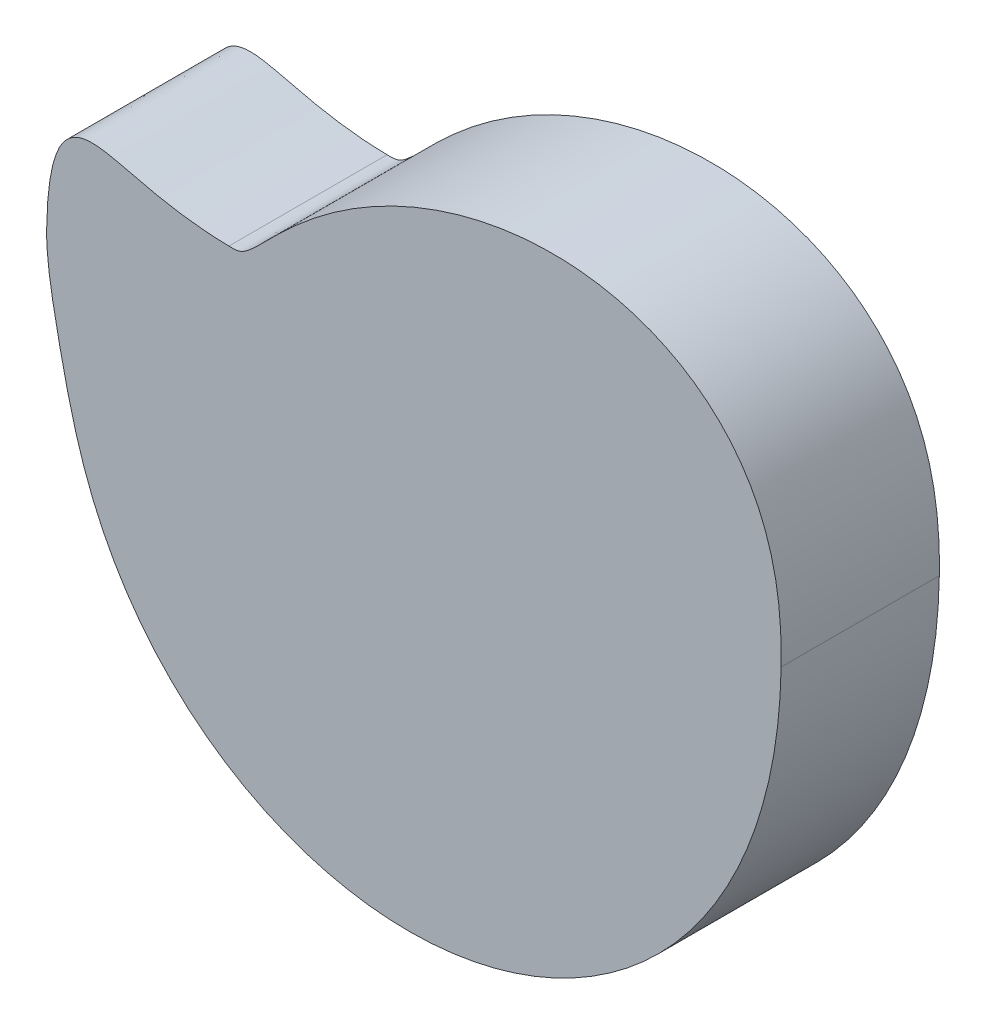
ISO-10303-21;
HEADER;
FILE_DESCRIPTION(('STEP AP214'),'2;1');
FILE_NAME('part.step','',(''),(''),'','','');
FILE_SCHEMA(('AUTOMOTIVE_DESIGN { 1 0 10303 214 1 1 1 1 }'));
ENDSEC;
DATA;
#1=APPLICATION_CONTEXT('core data for automotive mechanical design processes');
#2=APPLICATION_PROTOCOL_DEFINITION('international standard','automotive_design',2000,#1);
#3=PRODUCT_CONTEXT('',#1,'mechanical');
#4=PRODUCT('Part','Part','',(#3));
#5=PRODUCT_RELATED_PRODUCT_CATEGORY('part','',(#4));
#6=PRODUCT_DEFINITION_FORMATION('','',#4);
#7=PRODUCT_DEFINITION_CONTEXT('part definition',#1,'design');
#8=PRODUCT_DEFINITION('design','',#6,#7);
#9=PRODUCT_DEFINITION_SHAPE('','',#8);
#10=(LENGTH_UNIT() NAMED_UNIT(*) SI_UNIT(.MILLI.,.METRE.));
#11=(NAMED_UNIT(*) PLANE_ANGLE_UNIT() SI_UNIT($,.RADIAN.));
#12=(NAMED_UNIT(*) SI_UNIT($,.STERADIAN.) SOLID_ANGLE_UNIT());
#13=UNCERTAINTY_MEASURE_WITH_UNIT(LENGTH_MEASURE(1.E-05),#10,'distance_accuracy_value','');
#14=(GEOMETRIC_REPRESENTATION_CONTEXT(3) GLOBAL_UNCERTAINTY_ASSIGNED_CONTEXT((#13)) GLOBAL_UNIT_ASSIGNED_CONTEXT((#10,
#11,#12)) REPRESENTATION_CONTEXT('',''));
#15=CARTESIAN_POINT('',(0.,0.,0.));
#16=DIRECTION('',(0.,0.,1.));
#17=DIRECTION('',(1.,0.,0.));
#18=AXIS2_PLACEMENT_3D('',#15,#16,#17);
#19=CARTESIAN_POINT('',(69.998811140177,-0.653452584900594,20.));
#20=CARTESIAN_POINT('',(69.9962802606768,-0.80282905193423,20.));
#21=CARTESIAN_POINT('',(69.9902208525941,-1.09458744396149,20.));
#22=CARTESIAN_POINT('',(69.9742626990175,-1.73918612678377,20.));
#23=CARTESIAN_POINT('',(69.9506146409642,-2.33836731690116,20.));
#24=CARTESIAN_POINT('',(69.9100236263824,-3.23412195359361,20.));
#25=CARTESIAN_POINT('',(69.8487920108159,-4.23488834275558,20.));
#26=CARTESIAN_POINT('',(69.7563123500048,-5.44472611450939,20.));
#27=CARTESIAN_POINT('',(69.6228227592227,-6.79851808741762,20.));
#28=CARTESIAN_POINT('',(69.460461293575,-8.16341536992499,20.));
#29=CARTESIAN_POINT('',(69.2692414784587,-9.51627246653767,20.));
#30=CARTESIAN_POINT('',(69.0485912669528,-10.8696133684943,20.));
#31=CARTESIAN_POINT('',(68.7983176336395,-12.2147919486517,20.));
#32=CARTESIAN_POINT('',(68.5180342400937,-13.5558622770326,20.));
#33=CARTESIAN_POINT('',(68.2075090357461,-14.8891538431174,20.));
#34=CARTESIAN_POINT('',(67.8664562446968,-16.2156383350755,20.));
#35=CARTESIAN_POINT('',(67.4946648660791,-17.5334347919806,20.));
#36=CARTESIAN_POINT('',(67.0919231330588,-18.8423533381347,20.));
#37=CARTESIAN_POINT('',(66.6580666630912,-20.1411460305897,20.));
#38=CARTESIAN_POINT('',(66.1929516424067,-21.4291661207347,20.));
#39=CARTESIAN_POINT('',(65.6964732415011,-22.705379393146,20.));
#40=CARTESIAN_POINT('',(65.0365777264447,-24.2848303096609,20.));
#41=CARTESIAN_POINT('',(63.8968110510776,-26.7756310232163,20.));
#42=CARTESIAN_POINT('',(62.4493173352622,-29.4988355269483,20.));
#43=CARTESIAN_POINT('',(60.6326292546219,-32.4046935244352,20.));
#44=CARTESIAN_POINT('',(58.6123986494386,-35.1702513591954,20.));
#45=CARTESIAN_POINT('',(56.8767312626089,-37.2903230800499,20.));
#46=CARTESIAN_POINT('',(54.5543679776766,-39.8230325056132,20.));
#47=CARTESIAN_POINT('',(51.543500376313,-42.6417850527887,20.));
#48=CARTESIAN_POINT('',(47.7251273785978,-45.5750406943762,20.));
#49=CARTESIAN_POINT('',(42.9929093963224,-48.3812562872062,20.));
#50=CARTESIAN_POINT('',(37.937318134281,-50.5982700302847,20.));
#51=CARTESIAN_POINT('',(32.615906499919,-52.1765019156233,20.));
#52=CARTESIAN_POINT('',(27.1072465104206,-53.0699063488008,20.));
#53=CARTESIAN_POINT('',(21.4996033747864,-53.2441713372864,20.));
#54=CARTESIAN_POINT('',(15.9168519238734,-52.6866292315394,20.));
#55=CARTESIAN_POINT('',(10.4548694753436,-51.4037476301565,20.));
#56=CARTESIAN_POINT('',(5.20805320446119,-49.4161935320205,20.));
#57=CARTESIAN_POINT('',(0.266965943790503,-46.7582449027088,20.));
#58=CARTESIAN_POINT('',(-3.71513452247623,-43.8871457040942,20.));
#59=CARTESIAN_POINT('',(-6.83716953013065,-41.0735627475727,20.));
#60=CARTESIAN_POINT('',(-9.22480258633339,-38.5157964640865,20.));
#61=CARTESIAN_POINT('',(-10.9995459376571,-36.3511591971393,20.));
#62=CARTESIAN_POINT('',(-12.7304398274647,-33.9428488013515,20.));
#63=CARTESIAN_POINT('',(-14.3830656463562,-31.2812613343131,20.));
#64=CARTESIAN_POINT('',(-15.8439342578662,-28.5094094561044,20.));
#65=CARTESIAN_POINT('',(-17.1146877178155,-25.646281173357,20.));
#66=CARTESIAN_POINT('',(-18.1575396153297,-22.87057462196,20.));
#67=CARTESIAN_POINT('',(-19.0126919495131,-20.2062308040494,20.));
#68=CARTESIAN_POINT('',(-19.7563721502024,-17.5089920909637,20.));
#69=CARTESIAN_POINT('',(-20.4133755837632,-14.789664210606,20.));
#70=CARTESIAN_POINT('',(-20.9382239554045,-12.3989249728729,20.));
#71=CARTESIAN_POINT('',(-21.3676480801718,-10.3453792909695,20.));
#72=CARTESIAN_POINT('',(-21.7119482565548,-8.63134202986937,20.));
#73=CARTESIAN_POINT('',(-21.9765681282614,-7.2579296072446,20.));
#74=CARTESIAN_POINT('',(-22.1971401447687,-6.03681456631008,20.));
#75=CARTESIAN_POINT('',(-22.3738294613666,-4.96800318238054,20.));
#76=CARTESIAN_POINT('',(-22.5099938730841,-4.05276590917512,20.));
#77=CARTESIAN_POINT('',(-22.6114252988122,-3.29147361353848,20.));
#78=CARTESIAN_POINT('',(-22.6993518269821,-2.5292366804464,20.));
#79=CARTESIAN_POINT('',(-22.7716148327162,-1.76399762504704,20.));
#80=CARTESIAN_POINT('',(-22.819281051065,-1.09548816367898,20.));
#81=CARTESIAN_POINT('',(-22.8451580083226,-0.565511188836867,20.));
#82=CARTESIAN_POINT('',(-22.8577147257473,-0.185256378547976,20.));
#83=CARTESIAN_POINT('',(-22.8631929144728,0.0531263644279066,20.));
#84=CARTESIAN_POINT('',(-22.8660512076708,0.248202442117592,20.));
#85=CARTESIAN_POINT('',(-22.8673031315266,0.450386942015034,20.));
#86=CARTESIAN_POINT('',(-22.8670073548948,0.654111362240895,20.));
#87=CARTESIAN_POINT('',(-22.8658320009819,0.794250234163967,20.));
#88=CARTESIAN_POINT('',(-22.8646807412842,0.878041737602729,20.));
#89=CARTESIAN_POINT('',(-22.8639712364946,0.919917819969421,20.));
#90=B_SPLINE_CURVE_WITH_KNOTS('',4,(#19,#20,#21,#22,#23,#24,#25,#26,#27,#28,#29,#30,#31,#32,#33,
#34,#35,#36,#37,#38,#39,#40,#41,#42,#43,#44,#45,#46,#47,#48,#49,#50,#51,#52,#53,#54,#55,#56,#57,
#58,#59,#60,#61,#62,#63,#64,#65,#66,#67,#68,#69,#70,#71,#72,#73,#74,#75,#76,#77,#78,#79,#80,#81,
#82,#83,#84,#85,#86,#87,#88,#89),.UNSPECIFIED.,.F.,.F.,(5,1,1,1,1,1,1,1,1,1,1,1,1,1,1,1,1,1,1,1,
1,1,1,1,1,1,1,1,1,1,1,1,1,1,1,1,1,1,1,1,1,1,1,1,1,1,1,1,1,1,1,1,1,1,1,1,1,1,1,1,1,1,1,1,1,1,1,
5),(0.0872867349555559,0.0910891372792561,0.0948915396029563,0.0986939419266564,
0.102496344250357,0.110101148897757,0.117705953545157,0.125310758192558,0.132915562839958,
0.140520367487358,0.148125172134759,0.155729978217746,0.163334784300732,0.170939590383719,
0.178544396466706,0.186149202549693,0.19375400863268,0.201358814715667,0.208963620798653,
0.216568425977464,0.224173231156274,0.239382841513894,0.269802062229134,0.285011675955639,
0.300221289682145,0.31543090340865,0.330640517135155,0.361310619663562,0.391729917099579,
0.422149113967499,0.452568309378908,0.483639973393714,0.514711605323261,0.545783189159578,
0.576854883051291,0.607926524798288,0.638998111590847,0.670069826266896,0.701141369164623,
0.716677270094364,0.732213171024105,0.74774896607478,0.763284761125455,0.782521143203845,
0.801757525282235,0.817293317353628,0.832829109425021,0.848364901496413,0.863900693567806,
0.87943644659796,0.894972199628114,0.902740076143191,0.910507952658268,0.918275829173345,
0.926043705688423,0.930307555676197,0.934571405663971,0.938835255651745,0.943099105639519,
0.947362955627293,0.951626805615067,0.953758730608954,0.954824693105898,0.955890655602841,
0.956956618099785,0.958022580596728,0.959088543093672,0.960154505590615),.UNSPECIFIED.);
#91=DIRECTION('',(0.,0.,-1.));
#92=VECTOR('',#91,1.);
#93=SURFACE_OF_LINEAR_EXTRUSION('',#90,#92);
#94=CARTESIAN_POINT('',(69.998811140177,-0.653452584900594,0.));
#95=CARTESIAN_POINT('',(69.9962802606768,-0.80282905193423,0.));
#96=CARTESIAN_POINT('',(69.9902208525941,-1.09458744396149,0.));
#97=CARTESIAN_POINT('',(69.9742626990175,-1.73918612678377,0.));
#98=CARTESIAN_POINT('',(69.9506146409642,-2.33836731690116,0.));
#99=CARTESIAN_POINT('',(69.9100236263824,-3.23412195359361,0.));
#100=CARTESIAN_POINT('',(69.8487920108159,-4.23488834275558,0.));
#101=CARTESIAN_POINT('',(69.7563123500048,-5.44472611450939,0.));
#102=CARTESIAN_POINT('',(69.6228227592227,-6.79851808741762,0.));
#103=CARTESIAN_POINT('',(69.460461293575,-8.16341536992499,0.));
#104=CARTESIAN_POINT('',(69.2692414784587,-9.51627246653767,0.));
#105=CARTESIAN_POINT('',(69.0485912669528,-10.8696133684943,0.));
#106=CARTESIAN_POINT('',(68.7983176336395,-12.2147919486517,0.));
#107=CARTESIAN_POINT('',(68.5180342400937,-13.5558622770326,0.));
#108=CARTESIAN_POINT('',(68.2075090357461,-14.8891538431174,0.));
#109=CARTESIAN_POINT('',(67.8664562446968,-16.2156383350755,0.));
#110=CARTESIAN_POINT('',(67.4946648660791,-17.5334347919806,0.));
#111=CARTESIAN_POINT('',(67.0919231330588,-18.8423533381347,0.));
#112=CARTESIAN_POINT('',(66.6580666630912,-20.1411460305897,0.));
#113=CARTESIAN_POINT('',(66.1929516424067,-21.4291661207347,0.));
#114=CARTESIAN_POINT('',(65.6964732415011,-22.705379393146,0.));
#115=CARTESIAN_POINT('',(65.0365777264447,-24.2848303096609,0.));
#116=CARTESIAN_POINT('',(63.8968110510776,-26.7756310232163,0.));
#117=CARTESIAN_POINT('',(62.4493173352622,-29.4988355269483,0.));
#118=CARTESIAN_POINT('',(60.6326292546219,-32.4046935244352,0.));
#119=CARTESIAN_POINT('',(58.6123986494386,-35.1702513591954,0.));
#120=CARTESIAN_POINT('',(56.8767312626089,-37.2903230800499,0.));
#121=CARTESIAN_POINT('',(54.5543679776766,-39.8230325056132,0.));
#122=CARTESIAN_POINT('',(51.543500376313,-42.6417850527887,0.));
#123=CARTESIAN_POINT('',(47.7251273785978,-45.5750406943762,0.));
#124=CARTESIAN_POINT('',(42.9929093963224,-48.3812562872062,0.));
#125=CARTESIAN_POINT('',(37.937318134281,-50.5982700302847,0.));
#126=CARTESIAN_POINT('',(32.615906499919,-52.1765019156233,0.));
#127=CARTESIAN_POINT('',(27.1072465104206,-53.0699063488008,0.));
#128=CARTESIAN_POINT('',(21.4996033747864,-53.2441713372864,0.));
#129=CARTESIAN_POINT('',(15.9168519238734,-52.6866292315394,0.));
#130=CARTESIAN_POINT('',(10.4548694753436,-51.4037476301565,0.));
#131=CARTESIAN_POINT('',(5.20805320446119,-49.4161935320205,0.));
#132=CARTESIAN_POINT('',(0.266965943790503,-46.7582449027088,0.));
#133=CARTESIAN_POINT('',(-3.71513452247623,-43.8871457040942,0.));
#134=CARTESIAN_POINT('',(-6.83716953013065,-41.0735627475727,0.));
#135=CARTESIAN_POINT('',(-9.22480258633339,-38.5157964640865,0.));
#136=CARTESIAN_POINT('',(-10.9995459376571,-36.3511591971393,0.));
#137=CARTESIAN_POINT('',(-12.7304398274647,-33.9428488013515,0.));
#138=CARTESIAN_POINT('',(-14.3830656463562,-31.2812613343131,0.));
#139=CARTESIAN_POINT('',(-15.8439342578662,-28.5094094561044,0.));
#140=CARTESIAN_POINT('',(-17.1146877178155,-25.646281173357,0.));
#141=CARTESIAN_POINT('',(-18.1575396153297,-22.87057462196,0.));
#142=CARTESIAN_POINT('',(-19.0126919495131,-20.2062308040494,0.));
#143=CARTESIAN_POINT('',(-19.7563721502024,-17.5089920909637,0.));
#144=CARTESIAN_POINT('',(-20.4133755837632,-14.789664210606,0.));
#145=CARTESIAN_POINT('',(-20.9382239554045,-12.3989249728729,0.));
#146=CARTESIAN_POINT('',(-21.3676480801718,-10.3453792909695,0.));
#147=CARTESIAN_POINT('',(-21.7119482565548,-8.63134202986937,0.));
#148=CARTESIAN_POINT('',(-21.9765681282614,-7.2579296072446,0.));
#149=CARTESIAN_POINT('',(-22.1971401447687,-6.03681456631008,0.));
#150=CARTESIAN_POINT('',(-22.3738294613666,-4.96800318238054,0.));
#151=CARTESIAN_POINT('',(-22.5099938730841,-4.05276590917512,0.));
#152=CARTESIAN_POINT('',(-22.6114252988122,-3.29147361353848,0.));
#153=CARTESIAN_POINT('',(-22.6993518269821,-2.5292366804464,0.));
#154=CARTESIAN_POINT('',(-22.7716148327162,-1.76399762504704,0.));
#155=CARTESIAN_POINT('',(-22.819281051065,-1.09548816367898,0.));
#156=CARTESIAN_POINT('',(-22.8451580083226,-0.565511188836867,0.));
#157=CARTESIAN_POINT('',(-22.8577147257473,-0.185256378547976,0.));
#158=CARTESIAN_POINT('',(-22.8631929144728,0.0531263644279066,0.));
#159=CARTESIAN_POINT('',(-22.8660512076708,0.248202442117592,0.));
#160=CARTESIAN_POINT('',(-22.8673031315266,0.450386942015034,0.));
#161=CARTESIAN_POINT('',(-22.8670073548948,0.654111362240895,0.));
#162=CARTESIAN_POINT('',(-22.8658320009819,0.794250234163967,0.));
#163=CARTESIAN_POINT('',(-22.8646807412842,0.878041737602729,0.));
#164=CARTESIAN_POINT('',(-22.8639712364946,0.919917819969421,0.));
#165=B_SPLINE_CURVE_WITH_KNOTS('',4,(#94,#95,#96,#97,#98,#99,#100,#101,#102,#103,#104,#105,#106,
#107,#108,#109,#110,#111,#112,#113,#114,#115,#116,#117,#118,#119,#120,#121,#122,#123,#124,#125,
#126,#127,#128,#129,#130,#131,#132,#133,#134,#135,#136,#137,#138,#139,#140,#141,#142,#143,#144,
#145,#146,#147,#148,#149,#150,#151,#152,#153,#154,#155,#156,#157,#158,#159,#160,#161,#162,#163,
#164),.UNSPECIFIED.,.F.,.F.,(5,1,1,1,1,1,1,1,1,1,1,1,1,1,1,1,1,1,1,1,1,1,1,1,1,1,1,1,1,1,1,1,1,
1,1,1,1,1,1,1,1,1,1,1,1,1,1,1,1,1,1,1,1,1,1,1,1,1,1,1,1,1,1,1,1,1,1,5),(0.0872867349555559,
0.0910891372792561,0.0948915396029563,0.0986939419266564,0.102496344250357,0.110101148897757,
0.117705953545157,0.125310758192558,0.132915562839958,0.140520367487358,0.148125172134759,
0.155729978217746,0.163334784300732,0.170939590383719,0.178544396466706,0.186149202549693,
0.19375400863268,0.201358814715667,0.208963620798653,0.216568425977464,0.224173231156274,
0.239382841513894,0.269802062229134,0.285011675955639,0.300221289682145,0.31543090340865,
0.330640517135155,0.361310619663562,0.391729917099579,0.422149113967499,0.452568309378908,
0.483639973393714,0.514711605323261,0.545783189159578,0.576854883051291,0.607926524798288,
0.638998111590847,0.670069826266896,0.701141369164623,0.716677270094364,0.732213171024105,
0.74774896607478,0.763284761125455,0.782521143203845,0.801757525282235,0.817293317353628,
0.832829109425021,0.848364901496413,0.863900693567806,0.87943644659796,0.894972199628114,
0.902740076143191,0.910507952658268,0.918275829173345,0.926043705688423,0.930307555676197,
0.934571405663971,0.938835255651745,0.943099105639519,0.947362955627293,0.951626805615067,
0.953758730608954,0.954824693105898,0.955890655602841,0.956956618099785,0.958022580596728,
0.959088543093672,0.960154505590615),.UNSPECIFIED.);
#166=CARTESIAN_POINT('',(69.9988111399166,-0.653452584945648,0.));
#167=VERTEX_POINT('',#166);
#168=CARTESIAN_POINT('',(-22.8639712364525,0.919917819387929,0.));
#169=VERTEX_POINT('',#168);
#170=EDGE_CURVE('E142',#167,#169,#165,.T.);
#171=ORIENTED_EDGE('',*,*,#170,.F.);
#172=DIRECTION('',(0.,0.,-1.));
#173=VECTOR('',#172,1.);
#174=CARTESIAN_POINT('',(69.9988111399166,-0.653452584945648,20.));
#175=LINE('',#174,#173);
#176=CARTESIAN_POINT('',(69.9988111399166,-0.653452584945648,20.));
#177=VERTEX_POINT('',#176);
#178=EDGE_CURVE('E11',#177,#167,#175,.T.);
#179=ORIENTED_EDGE('',*,*,#178,.F.);
#180=CARTESIAN_POINT('',(-22.8639712364525,0.919917819387929,20.));
#181=VERTEX_POINT('',#180);
#182=EDGE_CURVE('E79',#177,#181,#90,.T.);
#183=ORIENTED_EDGE('',*,*,#182,.T.);
#184=DIRECTION('',(0.,0.,-1.));
#185=VECTOR('',#184,1.);
#186=CARTESIAN_POINT('',(-22.8639712364525,0.919917819387929,20.));
#187=LINE('',#186,#185);
#188=EDGE_CURVE('E38',#181,#169,#187,.T.);
#189=ORIENTED_EDGE('',*,*,#188,.T.);
#190=EDGE_LOOP('',(#171,#179,#183,#189));
#191=FACE_BOUND('',#190,.T.);
#192=ADVANCED_FACE('F34',(#191),#93,.T.);
#193=CARTESIAN_POINT('',(0.178261499696298,10.5309494084581,20.));
#194=CARTESIAN_POINT('',(0.244905955799118,10.5298202541074,20.));
#195=CARTESIAN_POINT('',(0.373277942330981,10.526166579227,20.));
#196=CARTESIAN_POINT('',(0.643494695616854,10.5189765045603,20.));
#197=CARTESIAN_POINT('',(0.91372992333648,10.5261489617897,20.));
#198=CARTESIAN_POINT('',(1.20003109149055,10.5591855309134,20.));
#199=CARTESIAN_POINT('',(1.43584815753809,10.6175773505273,20.));
#200=CARTESIAN_POINT('',(1.65239855470492,10.6916432975204,20.));
#201=CARTESIAN_POINT('',(1.83468414749063,10.7726568157455,20.));
#202=CARTESIAN_POINT('',(2.05210515050799,10.8863058717304,20.));
#203=CARTESIAN_POINT('',(2.29574087211692,11.03892621941,20.));
#204=CARTESIAN_POINT('',(2.56446011808571,11.2333520732924,20.));
#205=CARTESIAN_POINT('',(2.85493374373016,11.4695840704988,20.));
#206=CARTESIAN_POINT('',(3.13673232082701,11.7165384584497,20.));
#207=CARTESIAN_POINT('',(3.41175290929115,11.9706367966396,20.));
#208=CARTESIAN_POINT('',(3.68247448744309,12.2295063565274,20.));
#209=CARTESIAN_POINT('',(3.94999333051897,12.4915342097373,20.));
#210=CARTESIAN_POINT('',(4.22064519032003,12.7605976447339,20.));
#211=CARTESIAN_POINT('',(4.4950245927566,13.0359477772222,20.));
#212=CARTESIAN_POINT('',(4.844773386225,13.388476485757,20.));
#213=CARTESIAN_POINT('',(5.27031622839682,13.8177239310946,20.));
#214=CARTESIAN_POINT('',(5.7684461721941,14.3168732786506,20.));
#215=CARTESIAN_POINT('',(6.34205059619775,14.8829957441884,20.));
#216=CARTESIAN_POINT('',(6.92124338141483,15.4434096736706,20.));
#217=CARTESIAN_POINT('',(7.65319467566476,16.1356100866748,20.));
#218=CARTESIAN_POINT('',(8.54525265198668,16.951575586685,20.));
#219=CARTESIAN_POINT('',(9.60721281879878,17.8799374778478,20.));
#220=CARTESIAN_POINT('',(10.8504794814052,18.9061026685127,20.));
#221=CARTESIAN_POINT('',(12.1230494960057,19.8957090663879,20.));
#222=CARTESIAN_POINT('',(13.7495113300118,21.0853332002686,20.));
#223=CARTESIAN_POINT('',(15.4221270521762,22.2098595920442,20.));
#224=CARTESIAN_POINT('',(17.4815958444411,23.4780456331065,20.));
#225=CARTESIAN_POINT('',(19.6023247694743,24.6409069655643,20.));
#226=CARTESIAN_POINT('',(21.7687020675392,25.7164056218489,20.));
#227=CARTESIAN_POINT('',(24.3576626272751,26.838830595511,20.));
#228=CARTESIAN_POINT('',(27.002910599768,27.8236843539577,20.));
#229=CARTESIAN_POINT('',(30.0931862695952,28.7498496623273,20.));
#230=CARTESIAN_POINT('',(33.2392883814343,29.4643906680514,20.));
#231=CARTESIAN_POINT('',(37.2259006298557,30.0759378963135,20.));
#232=CARTESIAN_POINT('',(42.0657529584302,30.3282135230411,20.));
#233=CARTESIAN_POINT('',(46.9087663994798,29.9147325732619,20.));
#234=CARTESIAN_POINT('',(51.620118242228,28.7380151333074,20.));
#235=CARTESIAN_POINT('',(55.0289982177812,27.3412400678394,20.));
#236=CARTESIAN_POINT('',(57.2547444706443,26.1584224709281,20.));
#237=CARTESIAN_POINT('',(59.3677449658863,24.7874956071968,20.));
#238=CARTESIAN_POINT('',(61.0571637523072,23.4616096798375,20.));
#239=CARTESIAN_POINT('',(62.6031508677715,21.9986427490449,20.));
#240=CARTESIAN_POINT('',(63.9926544957874,20.4146171594529,20.));
#241=CARTESIAN_POINT('',(65.0387688288602,19.031803865126,20.));
#242=CARTESIAN_POINT('',(66.0318947885836,17.5013871544946,20.));
#243=CARTESIAN_POINT('',(66.9499390699292,15.8208881805193,20.));
#244=CARTESIAN_POINT('',(67.7339939820908,14.0732252459674,20.));
#245=CARTESIAN_POINT('',(68.3859755373778,12.2734567917638,20.));
#246=CARTESIAN_POINT('',(68.8932440022144,10.5206831592605,20.));
#247=CARTESIAN_POINT('',(69.2792072068828,8.83248889477223,20.));
#248=CARTESIAN_POINT('',(69.538203350899,7.33542070624403,20.));
#249=CARTESIAN_POINT('',(69.7087346780435,6.05157795128669,20.));
#250=CARTESIAN_POINT('',(69.8188037837876,4.96697775281018,20.));
#251=CARTESIAN_POINT('',(69.8891357713478,4.11761088499807,20.));
#252=CARTESIAN_POINT('',(69.9418032502112,3.22661338194506,20.));
#253=CARTESIAN_POINT('',(69.9798137199561,2.40660260580205,20.));
#254=CARTESIAN_POINT('',(70.0010134790498,1.46431830456491,20.));
#255=CARTESIAN_POINT('',(70.012058201024,0.72552917397216,20.));
#256=CARTESIAN_POINT('',(70.0066902579238,-0.0829555746603879,20.));
#257=CARTESIAN_POINT('',(70.0020946801105,-0.459652906419302,20.));
#258=CARTESIAN_POINT('',(69.9988111399166,-0.653452584945648,20.));
#259=B_SPLINE_CURVE_WITH_KNOTS('',4,(#193,#194,#195,#196,#197,#198,#199,#200,#201,#202,#203,
#204,#205,#206,#207,#208,#209,#210,#211,#212,#213,#214,#215,#216,#217,#218,#219,#220,#221,#222,
#223,#224,#225,#226,#227,#228,#229,#230,#231,#232,#233,#234,#235,#236,#237,#238,#239,#240,#241,
#242,#243,#244,#245,#246,#247,#248,#249,#250,#251,#252,#253,#254,#255,#256,#257,#258),
.UNSPECIFIED.,.F.,.F.,(5,1,1,1,1,1,1,1,1,1,1,1,1,1,1,1,1,1,1,1,1,1,1,1,1,1,1,1,1,1,1,1,1,1,1,1,
1,1,1,1,1,1,1,1,1,1,1,1,1,1,1,1,1,1,1,1,1,1,1,1,1,1,5),(0.0154492760636788,0.018260570028975,
0.0210718640072992,0.0238831579856235,0.0266944519639477,0.0285908070228159,0.0304871620816841,
0.0323835171405523,0.0342798721994206,0.0378142768599828,0.041348681520545,0.0448830861811072,
0.0484174908416694,0.0519518955022317,0.0554863001627939,0.0590207048233561,0.0625551094839183,
0.0663581019594584,0.0701610944349985,0.0777670793860788,0.085373064337159,0.0929790492882392,
0.100585034239319,0.1081910191904,0.12340298909256,0.138614968620041,0.153826948147521,
0.169038927675002,0.184250907202483,0.214674950367613,0.229886971950178,0.2603110583082,
0.275523123083657,0.305947252634572,0.336371300390812,0.366795348147052,0.397219398401944,
0.427643448656837,0.488491589308029,0.549339601874981,0.579763675236901,0.610187748598822,
0.62726713956676,0.644346530534697,0.674770404389647,0.69112075561255,0.707471106835454,
0.723821358994853,0.740171611154252,0.75993238551096,0.779693159867669,0.796043438368678,
0.812393716869687,0.828743995370696,0.845094273871705,0.853269415520771,0.861444557169836,
0.869619698818902,0.877794840467968,0.885969982117034,0.894145123766099,0.902320265415165,
0.910495407064231),.UNSPECIFIED.);
#260=DIRECTION('',(0.,0.,-1.));
#261=VECTOR('',#260,1.);
#262=SURFACE_OF_LINEAR_EXTRUSION('',#259,#261);
#263=CARTESIAN_POINT('',(0.178261499696298,10.5309494084581,0.));
#264=CARTESIAN_POINT('',(0.244905955799118,10.5298202541074,0.));
#265=CARTESIAN_POINT('',(0.373277942330981,10.526166579227,0.));
#266=CARTESIAN_POINT('',(0.643494695616854,10.5189765045603,0.));
#267=CARTESIAN_POINT('',(0.91372992333648,10.5261489617897,0.));
#268=CARTESIAN_POINT('',(1.20003109149055,10.5591855309134,0.));
#269=CARTESIAN_POINT('',(1.43584815753809,10.6175773505273,0.));
#270=CARTESIAN_POINT('',(1.65239855470492,10.6916432975204,0.));
#271=CARTESIAN_POINT('',(1.83468414749063,10.7726568157455,0.));
#272=CARTESIAN_POINT('',(2.05210515050799,10.8863058717304,0.));
#273=CARTESIAN_POINT('',(2.29574087211692,11.03892621941,0.));
#274=CARTESIAN_POINT('',(2.56446011808571,11.2333520732924,0.));
#275=CARTESIAN_POINT('',(2.85493374373016,11.4695840704988,0.));
#276=CARTESIAN_POINT('',(3.13673232082701,11.7165384584497,0.));
#277=CARTESIAN_POINT('',(3.41175290929115,11.9706367966396,0.));
#278=CARTESIAN_POINT('',(3.68247448744309,12.2295063565274,0.));
#279=CARTESIAN_POINT('',(3.94999333051897,12.4915342097373,0.));
#280=CARTESIAN_POINT('',(4.22064519032003,12.7605976447339,0.));
#281=CARTESIAN_POINT('',(4.4950245927566,13.0359477772222,0.));
#282=CARTESIAN_POINT('',(4.844773386225,13.388476485757,0.));
#283=CARTESIAN_POINT('',(5.27031622839682,13.8177239310946,0.));
#284=CARTESIAN_POINT('',(5.7684461721941,14.3168732786506,0.));
#285=CARTESIAN_POINT('',(6.34205059619775,14.8829957441884,0.));
#286=CARTESIAN_POINT('',(6.92124338141483,15.4434096736706,0.));
#287=CARTESIAN_POINT('',(7.65319467566476,16.1356100866748,0.));
#288=CARTESIAN_POINT('',(8.54525265198668,16.951575586685,0.));
#289=CARTESIAN_POINT('',(9.60721281879878,17.8799374778478,0.));
#290=CARTESIAN_POINT('',(10.8504794814052,18.9061026685127,0.));
#291=CARTESIAN_POINT('',(12.1230494960057,19.8957090663879,0.));
#292=CARTESIAN_POINT('',(13.7495113300118,21.0853332002686,0.));
#293=CARTESIAN_POINT('',(15.4221270521762,22.2098595920442,0.));
#294=CARTESIAN_POINT('',(17.4815958444411,23.4780456331065,0.));
#295=CARTESIAN_POINT('',(19.6023247694743,24.6409069655643,0.));
#296=CARTESIAN_POINT('',(21.7687020675392,25.7164056218489,0.));
#297=CARTESIAN_POINT('',(24.3576626272751,26.838830595511,0.));
#298=CARTESIAN_POINT('',(27.002910599768,27.8236843539577,0.));
#299=CARTESIAN_POINT('',(30.0931862695952,28.7498496623273,0.));
#300=CARTESIAN_POINT('',(33.2392883814343,29.4643906680514,0.));
#301=CARTESIAN_POINT('',(37.2259006298557,30.0759378963135,0.));
#302=CARTESIAN_POINT('',(42.0657529584302,30.3282135230411,0.));
#303=CARTESIAN_POINT('',(46.9087663994798,29.9147325732619,0.));
#304=CARTESIAN_POINT('',(51.620118242228,28.7380151333074,0.));
#305=CARTESIAN_POINT('',(55.0289982177812,27.3412400678394,0.));
#306=CARTESIAN_POINT('',(57.2547444706443,26.1584224709281,0.));
#307=CARTESIAN_POINT('',(59.3677449658863,24.7874956071968,0.));
#308=CARTESIAN_POINT('',(61.0571637523072,23.4616096798375,0.));
#309=CARTESIAN_POINT('',(62.6031508677715,21.9986427490449,0.));
#310=CARTESIAN_POINT('',(63.9926544957874,20.4146171594529,0.));
#311=CARTESIAN_POINT('',(65.0387688288602,19.031803865126,0.));
#312=CARTESIAN_POINT('',(66.0318947885836,17.5013871544946,0.));
#313=CARTESIAN_POINT('',(66.9499390699292,15.8208881805193,0.));
#314=CARTESIAN_POINT('',(67.7339939820908,14.0732252459674,0.));
#315=CARTESIAN_POINT('',(68.3859755373778,12.2734567917638,0.));
#316=CARTESIAN_POINT('',(68.8932440022144,10.5206831592605,0.));
#317=CARTESIAN_POINT('',(69.2792072068828,8.83248889477223,0.));
#318=CARTESIAN_POINT('',(69.538203350899,7.33542070624403,0.));
#319=CARTESIAN_POINT('',(69.7087346780435,6.05157795128669,0.));
#320=CARTESIAN_POINT('',(69.8188037837876,4.96697775281018,0.));
#321=CARTESIAN_POINT('',(69.8891357713478,4.11761088499807,0.));
#322=CARTESIAN_POINT('',(69.9418032502112,3.22661338194506,0.));
#323=CARTESIAN_POINT('',(69.9798137199561,2.40660260580205,0.));
#324=CARTESIAN_POINT('',(70.0010134790498,1.46431830456491,0.));
#325=CARTESIAN_POINT('',(70.012058201024,0.72552917397216,0.));
#326=CARTESIAN_POINT('',(70.0066902579238,-0.0829555746603879,0.));
#327=CARTESIAN_POINT('',(70.0020946801105,-0.459652906419302,0.));
#328=CARTESIAN_POINT('',(69.9988111399166,-0.653452584945648,0.));
#329=B_SPLINE_CURVE_WITH_KNOTS('',4,(#263,#264,#265,#266,#267,#268,#269,#270,#271,#272,#273,
#274,#275,#276,#277,#278,#279,#280,#281,#282,#283,#284,#285,#286,#287,#288,#289,#290,#291,#292,
#293,#294,#295,#296,#297,#298,#299,#300,#301,#302,#303,#304,#305,#306,#307,#308,#309,#310,#311,
#312,#313,#314,#315,#316,#317,#318,#319,#320,#321,#322,#323,#324,#325,#326,#327,#328),
.UNSPECIFIED.,.F.,.F.,(5,1,1,1,1,1,1,1,1,1,1,1,1,1,1,1,1,1,1,1,1,1,1,1,1,1,1,1,1,1,1,1,1,1,1,1,
1,1,1,1,1,1,1,1,1,1,1,1,1,1,1,1,1,1,1,1,1,1,1,1,1,1,5),(0.0154492760636788,0.018260570028975,
0.0210718640072992,0.0238831579856235,0.0266944519639477,0.0285908070228159,0.0304871620816841,
0.0323835171405523,0.0342798721994206,0.0378142768599828,0.041348681520545,0.0448830861811072,
0.0484174908416694,0.0519518955022317,0.0554863001627939,0.0590207048233561,0.0625551094839183,
0.0663581019594584,0.0701610944349985,0.0777670793860788,0.085373064337159,0.0929790492882392,
0.100585034239319,0.1081910191904,0.12340298909256,0.138614968620041,0.153826948147521,
0.169038927675002,0.184250907202483,0.214674950367613,0.229886971950178,0.2603110583082,
0.275523123083657,0.305947252634572,0.336371300390812,0.366795348147052,0.397219398401944,
0.427643448656837,0.488491589308029,0.549339601874981,0.579763675236901,0.610187748598822,
0.62726713956676,0.644346530534697,0.674770404389647,0.69112075561255,0.707471106835454,
0.723821358994853,0.740171611154252,0.75993238551096,0.779693159867669,0.796043438368678,
0.812393716869687,0.828743995370696,0.845094273871705,0.853269415520771,0.861444557169836,
0.869619698818902,0.877794840467968,0.885969982117034,0.894145123766099,0.902320265415165,
0.910495407064231),.UNSPECIFIED.);
#330=CARTESIAN_POINT('',(0.178261500763647,10.5309494084904,0.));
#331=VERTEX_POINT('',#330);
#332=EDGE_CURVE('E81',#331,#167,#329,.T.);
#333=ORIENTED_EDGE('',*,*,#332,.F.);
#334=DIRECTION('',(0.,0.,-1.));
#335=VECTOR('',#334,1.);
#336=CARTESIAN_POINT('',(0.178261500763647,10.5309494084904,20.));
#337=LINE('',#336,#335);
#338=CARTESIAN_POINT('',(0.178261500763647,10.5309494084904,20.));
#339=VERTEX_POINT('',#338);
#340=EDGE_CURVE('E44',#339,#331,#337,.T.);
#341=ORIENTED_EDGE('',*,*,#340,.F.);
#342=EDGE_CURVE('E76',#339,#177,#259,.T.);
#343=ORIENTED_EDGE('',*,*,#342,.T.);
#344=ORIENTED_EDGE('',*,*,#178,.T.);
#345=EDGE_LOOP('',(#333,#341,#343,#344));
#346=FACE_BOUND('',#345,.T.);
#347=ADVANCED_FACE('F103',(#346),#262,.T.);
#348=CARTESIAN_POINT('',(-22.8639712364525,0.919917819387929,20.));
#349=CARTESIAN_POINT('',(-22.7228208210132,9.25083611746322,20.));
#350=CARTESIAN_POINT('',(-18.6663311800279,16.4026282025245,20.));
#351=CARTESIAN_POINT('',(-10.3003198672176,10.7084875932156,20.));
#352=CARTESIAN_POINT('',(0.178261500763647,10.5309494084904,20.));
#353=B_SPLINE_CURVE_WITH_KNOTS('',3,(#348,#349,#350,#351,#352),.UNSPECIFIED.,.F.,.F.,(4,1,4),
(0.,0.39807444896527,1.),.UNSPECIFIED.);
#354=DIRECTION('',(0.,0.,-1.));
#355=VECTOR('',#354,1.);
#356=SURFACE_OF_LINEAR_EXTRUSION('',#353,#355);
#357=CARTESIAN_POINT('',(-22.8639712364525,0.919917819387929,0.));
#358=CARTESIAN_POINT('',(-22.7228208210132,9.25083611746322,0.));
#359=CARTESIAN_POINT('',(-18.6663311800279,16.4026282025245,0.));
#360=CARTESIAN_POINT('',(-10.3003198672176,10.7084875932156,0.));
#361=CARTESIAN_POINT('',(0.178261500763647,10.5309494084904,0.));
#362=B_SPLINE_CURVE_WITH_KNOTS('',3,(#357,#358,#359,#360,#361),.UNSPECIFIED.,.F.,.F.,(4,1,4),
(0.,0.39807444896527,1.),.UNSPECIFIED.);
#363=EDGE_CURVE('E74',#169,#331,#362,.T.);
#364=ORIENTED_EDGE('',*,*,#363,.F.);
#365=ORIENTED_EDGE('',*,*,#188,.F.);
#366=EDGE_CURVE('E72',#181,#339,#353,.T.);
#367=ORIENTED_EDGE('',*,*,#366,.T.);
#368=ORIENTED_EDGE('',*,*,#340,.T.);
#369=EDGE_LOOP('',(#364,#365,#367,#368));
#370=FACE_BOUND('',#369,.T.);
#371=ADVANCED_FACE('F71',(#370),#356,.T.);
#372=CARTESIAN_POINT('',(22.6796683988603,-53.1159076378719,20.));
#373=DIRECTION('',(0.,0.,1.));
#374=DIRECTION('',(1.,0.,0.));
#375=AXIS2_PLACEMENT_3D('',#372,#373,#374);
#376=PLANE('',#375);
#377=ORIENTED_EDGE('',*,*,#182,.F.);
#378=ORIENTED_EDGE('',*,*,#342,.F.);
#379=ORIENTED_EDGE('',*,*,#366,.F.);
#380=EDGE_LOOP('',(#377,#378,#379));
#381=FACE_BOUND('',#380,.T.);
#382=ADVANCED_FACE('F78',(#381),#376,.T.);
#383=CARTESIAN_POINT('',(22.6796683988603,-53.1159076378719,0.));
#384=DIRECTION('',(0.,0.,1.));
#385=DIRECTION('',(1.,0.,0.));
#386=AXIS2_PLACEMENT_3D('',#383,#384,#385);
#387=PLANE('',#386);
#388=ORIENTED_EDGE('',*,*,#170,.T.);
#389=ORIENTED_EDGE('',*,*,#363,.T.);
#390=ORIENTED_EDGE('',*,*,#332,.T.);
#391=EDGE_LOOP('',(#388,#389,#390));
#392=FACE_BOUND('',#391,.T.);
#393=ADVANCED_FACE('F106',(#392),#387,.F.);
#394=CLOSED_SHELL('',(#192,#347,#371,#382,#393));
#395=MANIFOLD_SOLID_BREP('B2',#394);
#396=ADVANCED_BREP_SHAPE_REPRESENTATION('',(#18,#395),#14);
#397=SHAPE_DEFINITION_REPRESENTATION(#9,#396);
ENDSEC;
END-ISO-10303-21;
